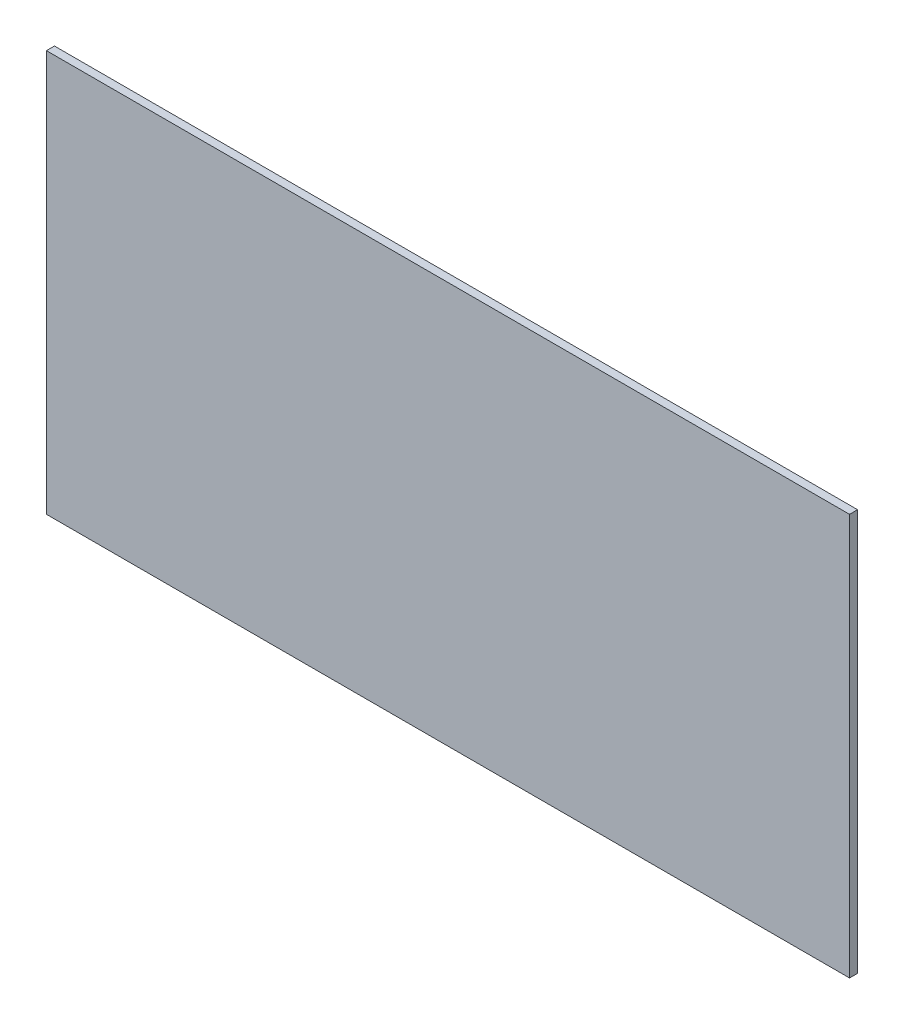
ISO-10303-21;
HEADER;
FILE_DESCRIPTION(('STEP AP214'),'2;1');
FILE_NAME('part.step','',(''),(''),'','','');
FILE_SCHEMA(('AUTOMOTIVE_DESIGN { 1 0 10303 214 1 1 1 1 }'));
ENDSEC;
DATA;
#1=APPLICATION_CONTEXT('core data for automotive mechanical design processes');
#2=APPLICATION_PROTOCOL_DEFINITION('international standard','automotive_design',2000,#1);
#3=PRODUCT_CONTEXT('',#1,'mechanical');
#4=PRODUCT('Part','Part','',(#3));
#5=PRODUCT_RELATED_PRODUCT_CATEGORY('part','',(#4));
#6=PRODUCT_DEFINITION_FORMATION('','',#4);
#7=PRODUCT_DEFINITION_CONTEXT('part definition',#1,'design');
#8=PRODUCT_DEFINITION('design','',#6,#7);
#9=PRODUCT_DEFINITION_SHAPE('','',#8);
#10=(LENGTH_UNIT() NAMED_UNIT(*) SI_UNIT(.MILLI.,.METRE.));
#11=(NAMED_UNIT(*) PLANE_ANGLE_UNIT() SI_UNIT($,.RADIAN.));
#12=(NAMED_UNIT(*) SI_UNIT($,.STERADIAN.) SOLID_ANGLE_UNIT());
#13=UNCERTAINTY_MEASURE_WITH_UNIT(LENGTH_MEASURE(1.E-05),#10,'distance_accuracy_value','');
#14=(GEOMETRIC_REPRESENTATION_CONTEXT(3) GLOBAL_UNCERTAINTY_ASSIGNED_CONTEXT((#13)) GLOBAL_UNIT_ASSIGNED_CONTEXT((#10,
#11,#12)) REPRESENTATION_CONTEXT('',''));
#15=CARTESIAN_POINT('',(0.,0.,0.));
#16=DIRECTION('',(0.,0.,1.));
#17=DIRECTION('',(1.,0.,0.));
#18=AXIS2_PLACEMENT_3D('',#15,#16,#17);
#19=CARTESIAN_POINT('',(500.,500.,-5.));
#20=DIRECTION('',(-1.,0.,0.));
#21=DIRECTION('',(0.,0.,1.));
#22=AXIS2_PLACEMENT_3D('',#19,#20,#21);
#23=PLANE('',#22);
#24=DIRECTION('',(0.,0.,-1.));
#25=VECTOR('',#24,1.);
#26=CARTESIAN_POINT('',(500.,0.,-5.));
#27=LINE('',#26,#25);
#28=CARTESIAN_POINT('',(500.,0.,5.));
#29=VERTEX_POINT('',#28);
#30=CARTESIAN_POINT('',(500.,0.,-5.));
#31=VERTEX_POINT('',#30);
#32=EDGE_CURVE('E96',#29,#31,#27,.T.);
#33=ORIENTED_EDGE('',*,*,#32,.T.);
#34=DIRECTION('',(0.,-1.,0.));
#35=VECTOR('',#34,1.);
#36=CARTESIAN_POINT('',(500.,500.,-5.));
#37=LINE('',#36,#35);
#38=CARTESIAN_POINT('',(500.,500.,-5.));
#39=VERTEX_POINT('',#38);
#40=EDGE_CURVE('E11',#39,#31,#37,.T.);
#41=ORIENTED_EDGE('',*,*,#40,.F.);
#42=DIRECTION('',(0.,0.,-1.));
#43=VECTOR('',#42,1.);
#44=CARTESIAN_POINT('',(500.,500.,-5.));
#45=LINE('',#44,#43);
#46=CARTESIAN_POINT('',(500.,500.,5.));
#47=VERTEX_POINT('',#46);
#48=EDGE_CURVE('E84',#47,#39,#45,.T.);
#49=ORIENTED_EDGE('',*,*,#48,.F.);
#50=DIRECTION('',(0.,-1.,0.));
#51=VECTOR('',#50,1.);
#52=CARTESIAN_POINT('',(500.,500.,5.));
#53=LINE('',#52,#51);
#54=EDGE_CURVE('E92',#47,#29,#53,.T.);
#55=ORIENTED_EDGE('',*,*,#54,.T.);
#56=EDGE_LOOP('',(#33,#41,#49,#55));
#57=FACE_BOUND('',#56,.T.);
#58=ADVANCED_FACE('F33',(#57),#23,.F.);
#59=CARTESIAN_POINT('',(-500.,500.,-5.));
#60=DIRECTION('',(0.,0.,1.));
#61=DIRECTION('',(1.,0.,0.));
#62=AXIS2_PLACEMENT_3D('',#59,#60,#61);
#63=PLANE('',#62);
#64=DIRECTION('',(-1.,0.,0.));
#65=VECTOR('',#64,1.);
#66=CARTESIAN_POINT('',(-500.,0.,-5.));
#67=LINE('',#66,#65);
#68=CARTESIAN_POINT('',(-500.,0.,-5.));
#69=VERTEX_POINT('',#68);
#70=EDGE_CURVE('E88',#31,#69,#67,.T.);
#71=ORIENTED_EDGE('',*,*,#70,.T.);
#72=DIRECTION('',(0.,-1.,0.));
#73=VECTOR('',#72,1.);
#74=CARTESIAN_POINT('',(-500.,500.,-5.));
#75=LINE('',#74,#73);
#76=CARTESIAN_POINT('',(-500.,500.,-5.));
#77=VERTEX_POINT('',#76);
#78=EDGE_CURVE('E41',#77,#69,#75,.T.);
#79=ORIENTED_EDGE('',*,*,#78,.F.);
#80=DIRECTION('',(-1.,0.,0.));
#81=VECTOR('',#80,1.);
#82=CARTESIAN_POINT('',(-500.,500.,-5.));
#83=LINE('',#82,#81);
#84=EDGE_CURVE('E79',#39,#77,#83,.T.);
#85=ORIENTED_EDGE('',*,*,#84,.F.);
#86=ORIENTED_EDGE('',*,*,#40,.T.);
#87=EDGE_LOOP('',(#71,#79,#85,#86));
#88=FACE_BOUND('',#87,.T.);
#89=ADVANCED_FACE('F87',(#88),#63,.F.);
#90=CARTESIAN_POINT('',(-500.,500.,-5.));
#91=DIRECTION('',(1.,0.,0.));
#92=DIRECTION('',(0.,0.,-1.));
#93=AXIS2_PLACEMENT_3D('',#90,#91,#92);
#94=PLANE('',#93);
#95=DIRECTION('',(0.,0.,1.));
#96=VECTOR('',#95,1.);
#97=CARTESIAN_POINT('',(-500.,0.,-5.));
#98=LINE('',#97,#96);
#99=CARTESIAN_POINT('',(-500.,0.,5.));
#100=VERTEX_POINT('',#99);
#101=EDGE_CURVE('E66',#69,#100,#98,.T.);
#102=ORIENTED_EDGE('',*,*,#101,.T.);
#103=DIRECTION('',(0.,-1.,0.));
#104=VECTOR('',#103,1.);
#105=CARTESIAN_POINT('',(-500.,500.,5.));
#106=LINE('',#105,#104);
#107=CARTESIAN_POINT('',(-500.,500.,5.));
#108=VERTEX_POINT('',#107);
#109=EDGE_CURVE('E89',#108,#100,#106,.T.);
#110=ORIENTED_EDGE('',*,*,#109,.F.);
#111=DIRECTION('',(0.,0.,1.));
#112=VECTOR('',#111,1.);
#113=CARTESIAN_POINT('',(-500.,500.,-5.));
#114=LINE('',#113,#112);
#115=EDGE_CURVE('E82',#77,#108,#114,.T.);
#116=ORIENTED_EDGE('',*,*,#115,.F.);
#117=ORIENTED_EDGE('',*,*,#78,.T.);
#118=EDGE_LOOP('',(#102,#110,#116,#117));
#119=FACE_BOUND('',#118,.T.);
#120=ADVANCED_FACE('F90',(#119),#94,.F.);
#121=CARTESIAN_POINT('',(-500.,500.,5.));
#122=DIRECTION('',(0.,0.,-1.));
#123=DIRECTION('',(-1.,0.,0.));
#124=AXIS2_PLACEMENT_3D('',#121,#122,#123);
#125=PLANE('',#124);
#126=DIRECTION('',(1.,0.,0.));
#127=VECTOR('',#126,1.);
#128=CARTESIAN_POINT('',(-500.,0.,5.));
#129=LINE('',#128,#127);
#130=EDGE_CURVE('E72',#100,#29,#129,.T.);
#131=ORIENTED_EDGE('',*,*,#130,.T.);
#132=ORIENTED_EDGE('',*,*,#54,.F.);
#133=DIRECTION('',(1.,0.,0.));
#134=VECTOR('',#133,1.);
#135=CARTESIAN_POINT('',(-500.,500.,5.));
#136=LINE('',#135,#134);
#137=EDGE_CURVE('E49',#108,#47,#136,.T.);
#138=ORIENTED_EDGE('',*,*,#137,.F.);
#139=ORIENTED_EDGE('',*,*,#109,.T.);
#140=EDGE_LOOP('',(#131,#132,#138,#139));
#141=FACE_BOUND('',#140,.T.);
#142=ADVANCED_FACE('F103',(#141),#125,.F.);
#143=CARTESIAN_POINT('',(0.,500.,0.));
#144=DIRECTION('',(0.,1.,0.));
#145=DIRECTION('',(0.,0.,1.));
#146=AXIS2_PLACEMENT_3D('',#143,#144,#145);
#147=PLANE('',#146);
#148=ORIENTED_EDGE('',*,*,#48,.T.);
#149=ORIENTED_EDGE('',*,*,#84,.T.);
#150=ORIENTED_EDGE('',*,*,#115,.T.);
#151=ORIENTED_EDGE('',*,*,#137,.T.);
#152=EDGE_LOOP('',(#148,#149,#150,#151));
#153=FACE_BOUND('',#152,.T.);
#154=ADVANCED_FACE('F80',(#153),#147,.T.);
#155=CARTESIAN_POINT('',(0.,0.,0.));
#156=DIRECTION('',(0.,1.,0.));
#157=DIRECTION('',(0.,0.,1.));
#158=AXIS2_PLACEMENT_3D('',#155,#156,#157);
#159=PLANE('',#158);
#160=ORIENTED_EDGE('',*,*,#32,.F.);
#161=ORIENTED_EDGE('',*,*,#130,.F.);
#162=ORIENTED_EDGE('',*,*,#101,.F.);
#163=ORIENTED_EDGE('',*,*,#70,.F.);
#164=EDGE_LOOP('',(#160,#161,#162,#163));
#165=FACE_BOUND('',#164,.T.);
#166=ADVANCED_FACE('F106',(#165),#159,.F.);
#167=CLOSED_SHELL('',(#58,#89,#120,#142,#154,#166));
#168=MANIFOLD_SOLID_BREP('B2',#167);
#169=ADVANCED_BREP_SHAPE_REPRESENTATION('',(#18,#168),#14);
#170=SHAPE_DEFINITION_REPRESENTATION(#9,#169);
ENDSEC;
END-ISO-10303-21;
